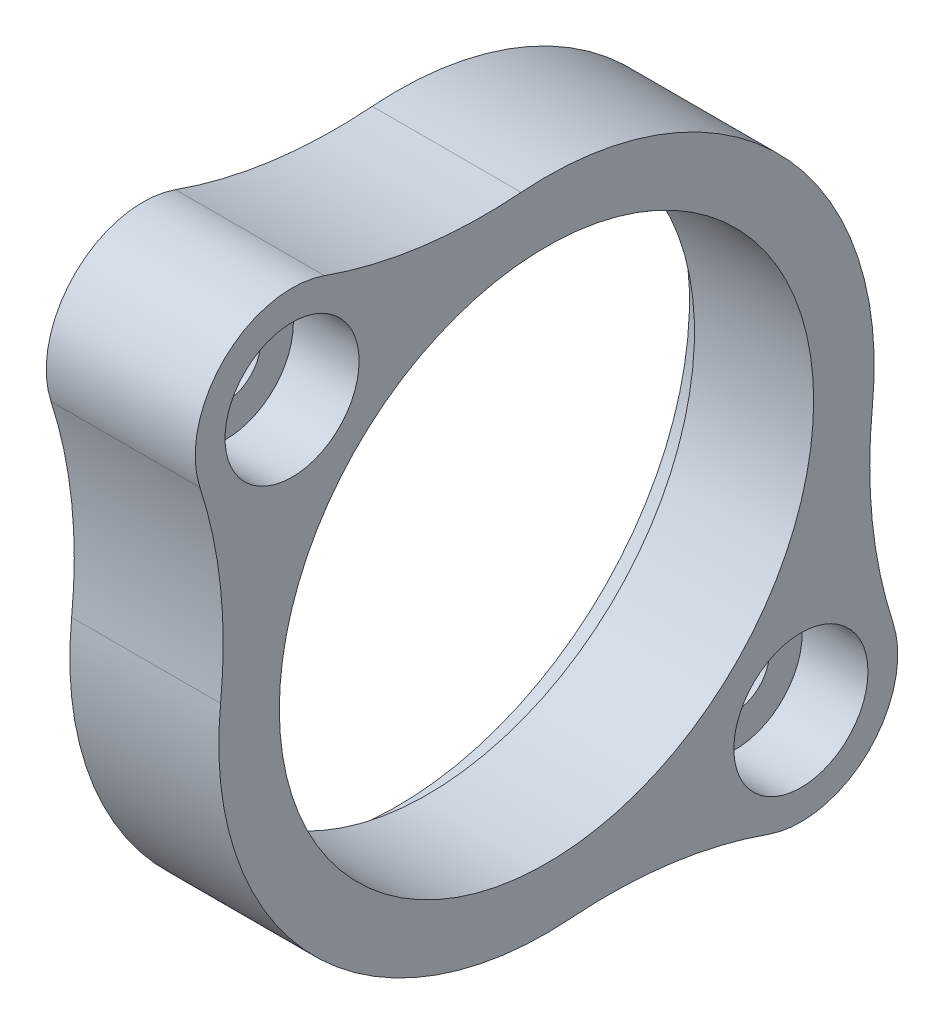
ISO-10303-21;
HEADER;
FILE_DESCRIPTION(('STEP AP214'),'2;1');
FILE_NAME('part.step','',(''),(''),'','','');
FILE_SCHEMA(('AUTOMOTIVE_DESIGN { 1 0 10303 214 1 1 1 1 }'));
ENDSEC;
DATA;
#1=APPLICATION_CONTEXT('core data for automotive mechanical design processes');
#2=APPLICATION_PROTOCOL_DEFINITION('international standard','automotive_design',2000,#1);
#3=PRODUCT_CONTEXT('',#1,'mechanical');
#4=PRODUCT('Part','Part','',(#3));
#5=PRODUCT_RELATED_PRODUCT_CATEGORY('part','',(#4));
#6=PRODUCT_DEFINITION_FORMATION('','',#4);
#7=PRODUCT_DEFINITION_CONTEXT('part definition',#1,'design');
#8=PRODUCT_DEFINITION('design','',#6,#7);
#9=PRODUCT_DEFINITION_SHAPE('','',#8);
#10=(LENGTH_UNIT() NAMED_UNIT(*) SI_UNIT(.MILLI.,.METRE.));
#11=(NAMED_UNIT(*) PLANE_ANGLE_UNIT() SI_UNIT($,.RADIAN.));
#12=(NAMED_UNIT(*) SI_UNIT($,.STERADIAN.) SOLID_ANGLE_UNIT());
#13=UNCERTAINTY_MEASURE_WITH_UNIT(LENGTH_MEASURE(1.E-05),#10,'distance_accuracy_value','');
#14=(GEOMETRIC_REPRESENTATION_CONTEXT(3) GLOBAL_UNCERTAINTY_ASSIGNED_CONTEXT((#13)) GLOBAL_UNIT_ASSIGNED_CONTEXT((#10,
#11,#12)) REPRESENTATION_CONTEXT('',''));
#15=CARTESIAN_POINT('',(0.,0.,0.));
#16=DIRECTION('',(0.,0.,1.));
#17=DIRECTION('',(1.,0.,0.));
#18=AXIS2_PLACEMENT_3D('',#15,#16,#17);
#19=CARTESIAN_POINT('',(54.0385,40.64,-145.269790757238));
#20=DIRECTION('',(-1.,0.,0.));
#21=DIRECTION('',(0.,0.,1.));
#22=AXIS2_PLACEMENT_3D('',#19,#20,#21);
#23=CYLINDRICAL_SURFACE('',#22,14.2367);
#24=CARTESIAN_POINT('',(54.0385,40.64,-145.269790757238));
#25=DIRECTION('',(1.,0.,0.));
#26=DIRECTION('',(0.,0.,-1.));
#27=AXIS2_PLACEMENT_3D('',#24,#25,#26);
#28=CIRCLE('',#27,14.2367);
#29=CARTESIAN_POINT('',(54.0385,40.64,-159.506490757238));
#30=VERTEX_POINT('',#29);
#31=EDGE_CURVE('E219',#30,#30,#28,.T.);
#32=ORIENTED_EDGE('',*,*,#31,.T.);
#33=EDGE_LOOP('',(#32));
#34=FACE_BOUND('',#33,.T.);
#35=CARTESIAN_POINT('',(47.6885,40.64,-145.269790757238));
#36=DIRECTION('',(-1.,0.,0.));
#37=DIRECTION('',(0.,0.,1.));
#38=AXIS2_PLACEMENT_3D('',#35,#36,#37);
#39=CIRCLE('',#38,14.2367);
#40=CARTESIAN_POINT('',(47.6885,40.64,-131.033090757238));
#41=VERTEX_POINT('',#40);
#42=EDGE_CURVE('E134',#41,#41,#39,.T.);
#43=ORIENTED_EDGE('',*,*,#42,.T.);
#44=EDGE_LOOP('',(#43));
#45=FACE_BOUND('',#44,.T.);
#46=ADVANCED_FACE('F130',(#34,#45),#23,.F.);
#47=CARTESIAN_POINT('',(54.0385,40.64,-145.269790757238));
#48=DIRECTION('',(-1.,0.,0.));
#49=DIRECTION('',(0.,0.,1.));
#50=AXIS2_PLACEMENT_3D('',#47,#48,#49);
#51=CYLINDRICAL_SURFACE('',#50,17.4625);
#52=CARTESIAN_POINT('',(54.0385,40.64,-145.269790757238));
#53=DIRECTION('',(1.,0.,0.));
#54=DIRECTION('',(0.,0.,-1.));
#55=AXIS2_PLACEMENT_3D('',#52,#53,#54);
#56=CIRCLE('',#55,17.4625);
#57=CARTESIAN_POINT('',(54.0385,42.477013840604,-127.904184335364));
#58=VERTEX_POINT('',#57);
#59=CARTESIAN_POINT('',(54.0385,23.2297021836331,-146.61902616865));
#60=VERTEX_POINT('',#59);
#61=EDGE_CURVE('E209',#58,#60,#56,.T.);
#62=ORIENTED_EDGE('',*,*,#61,.F.);
#63=DIRECTION('',(-1.,0.,0.));
#64=VECTOR('',#63,1.);
#65=CARTESIAN_POINT('',(54.0385,42.477013840604,-127.904184335364));
#66=LINE('',#65,#64);
#67=CARTESIAN_POINT('',(46.101,42.477013840604,-127.904184335364));
#68=VERTEX_POINT('',#67);
#69=EDGE_CURVE('E277',#58,#68,#66,.T.);
#70=ORIENTED_EDGE('',*,*,#69,.T.);
#71=CARTESIAN_POINT('',(46.101,40.64,-145.269790757238));
#72=DIRECTION('',(1.,0.,0.));
#73=DIRECTION('',(0.,0.,-1.));
#74=AXIS2_PLACEMENT_3D('',#71,#72,#73);
#75=CIRCLE('',#74,17.4625);
#76=CARTESIAN_POINT('',(46.101,23.2297021836331,-146.61902616865));
#77=VERTEX_POINT('',#76);
#78=EDGE_CURVE('E271',#68,#77,#75,.T.);
#79=ORIENTED_EDGE('',*,*,#78,.T.);
#80=DIRECTION('',(-1.,0.,0.));
#81=VECTOR('',#80,1.);
#82=CARTESIAN_POINT('',(54.0385,23.2297021836331,-146.61902616865));
#83=LINE('',#82,#81);
#84=EDGE_CURVE('E274',#77,#60,#83,.F.);
#85=ORIENTED_EDGE('',*,*,#84,.T.);
#86=EDGE_LOOP('',(#62,#70,#79,#85));
#87=FACE_BOUND('',#86,.T.);
#88=ADVANCED_FACE('F293',(#87),#51,.T.);
#89=CARTESIAN_POINT('',(54.0385,40.64,-145.269790757238));
#90=DIRECTION('',(1.,0.,0.));
#91=DIRECTION('',(0.,0.,-1.));
#92=AXIS2_PLACEMENT_3D('',#89,#90,#91);
#93=PLANE('',#92);
#94=CARTESIAN_POINT('',(54.0385,54.5829773591439,-131.712540757238));
#95=DIRECTION('',(1.,0.,0.));
#96=DIRECTION('',(0.,0.,-1.));
#97=AXIS2_PLACEMENT_3D('',#94,#95,#96);
#98=CIRCLE('',#97,3.57250999999999);
#99=CARTESIAN_POINT('',(54.0385,54.5829773591439,-135.285050757238));
#100=VERTEX_POINT('',#99);
#101=EDGE_CURVE('E253',#100,#100,#98,.T.);
#102=ORIENTED_EDGE('',*,*,#101,.F.);
#103=EDGE_LOOP('',(#102));
#104=FACE_BOUND('',#103,.T.);
#105=CARTESIAN_POINT('',(54.0385,26.6970226408561,-158.827040757238));
#106=DIRECTION('',(1.,0.,0.));
#107=DIRECTION('',(0.,0.,-1.));
#108=AXIS2_PLACEMENT_3D('',#105,#106,#107);
#109=CIRCLE('',#108,3.57250999999999);
#110=CARTESIAN_POINT('',(54.0385,26.6970226408561,-162.399550757238));
#111=VERTEX_POINT('',#110);
#112=EDGE_CURVE('E240',#111,#111,#109,.T.);
#113=ORIENTED_EDGE('',*,*,#112,.F.);
#114=EDGE_LOOP('',(#113));
#115=FACE_BOUND('',#114,.T.);
#116=CARTESIAN_POINT('',(54.0385,54.5829773591439,-131.712540757238));
#117=DIRECTION('',(1.,0.,0.));
#118=DIRECTION('',(0.,0.,-1.));
#119=AXIS2_PLACEMENT_3D('',#116,#117,#118);
#120=CIRCLE('',#119,5.16000999999995);
#121=CARTESIAN_POINT('',(54.0385,59.4443586334543,-133.442475815523));
#122=VERTEX_POINT('',#121);
#123=CARTESIAN_POINT('',(54.0385,52.9900707398373,-126.804552197526));
#124=VERTEX_POINT('',#123);
#125=EDGE_CURVE('E205',#122,#124,#120,.T.);
#126=ORIENTED_EDGE('',*,*,#125,.T.);
#127=CARTESIAN_POINT('',(54.0385,45.1490339723917,-102.645120449002));
#128=DIRECTION('',(1.,0.,0.));
#129=DIRECTION('',(0.,0.,-1.));
#130=AXIS2_PLACEMENT_3D('',#127,#128,#129);
#131=CIRCLE('',#130,25.4);
#132=EDGE_CURVE('E286',#124,#58,#131,.F.);
#133=ORIENTED_EDGE('',*,*,#132,.T.);
#134=ORIENTED_EDGE('',*,*,#61,.T.);
#135=CARTESIAN_POINT('',(54.0385,-2.0943673674461,-148.581550403432));
#136=DIRECTION('',(1.,0.,0.));
#137=DIRECTION('',(0.,0.,-1.));
#138=AXIS2_PLACEMENT_3D('',#135,#136,#137);
#139=CIRCLE('',#138,25.4);
#140=CARTESIAN_POINT('',(54.0385,21.8356413665457,-157.097105698953));
#141=VERTEX_POINT('',#140);
#142=EDGE_CURVE('E154',#60,#141,#139,.F.);
#143=ORIENTED_EDGE('',*,*,#142,.T.);
#144=CARTESIAN_POINT('',(54.0385,26.6970226408561,-158.827040757238));
#145=DIRECTION('',(1.,0.,0.));
#146=DIRECTION('',(0.,0.,-1.));
#147=AXIS2_PLACEMENT_3D('',#144,#145,#146);
#148=CIRCLE('',#147,5.16000999999998);
#149=CARTESIAN_POINT('',(54.0385,28.2899292601627,-163.735029316951));
#150=VERTEX_POINT('',#149);
#151=EDGE_CURVE('E236',#141,#150,#148,.T.);
#152=ORIENTED_EDGE('',*,*,#151,.T.);
#153=CARTESIAN_POINT('',(54.0385,36.1309660276084,-187.894461065474));
#154=DIRECTION('',(1.,0.,0.));
#155=DIRECTION('',(0.,0.,-1.));
#156=AXIS2_PLACEMENT_3D('',#153,#154,#155);
#157=CIRCLE('',#156,25.4);
#158=CARTESIAN_POINT('',(54.0385,38.802986159396,-162.635397179112));
#159=VERTEX_POINT('',#158);
#160=EDGE_CURVE('E12',#150,#159,#157,.F.);
#161=ORIENTED_EDGE('',*,*,#160,.T.);
#162=CARTESIAN_POINT('',(54.0385,58.0502978163669,-143.920555345826));
#163=VERTEX_POINT('',#162);
#164=EDGE_CURVE('E268',#159,#163,#56,.T.);
#165=ORIENTED_EDGE('',*,*,#164,.T.);
#166=CARTESIAN_POINT('',(54.0385,83.3743673674461,-141.958031111044));
#167=DIRECTION('',(1.,0.,0.));
#168=DIRECTION('',(0.,0.,-1.));
#169=AXIS2_PLACEMENT_3D('',#166,#167,#168);
#170=CIRCLE('',#169,25.4);
#171=EDGE_CURVE('E225',#163,#122,#170,.F.);
#172=ORIENTED_EDGE('',*,*,#171,.T.);
#173=EDGE_LOOP('',(#126,#133,#134,#143,#152,#161,#165,#172));
#174=FACE_BOUND('',#173,.T.);
#175=ORIENTED_EDGE('',*,*,#31,.F.);
#176=EDGE_LOOP('',(#175));
#177=FACE_BOUND('',#176,.T.);
#178=ADVANCED_FACE('F288',(#104,#115,#174,#177),#93,.T.);
#179=CARTESIAN_POINT('',(46.101,40.64,-145.269790757238));
#180=DIRECTION('',(1.,0.,0.));
#181=DIRECTION('',(0.,0.,-1.));
#182=AXIS2_PLACEMENT_3D('',#179,#180,#181);
#183=PLANE('',#182);
#184=CARTESIAN_POINT('',(46.101,40.64,-145.269790757238));
#185=DIRECTION('',(-1.,0.,0.));
#186=DIRECTION('',(0.,0.,1.));
#187=AXIS2_PLACEMENT_3D('',#184,#185,#186);
#188=CIRCLE('',#187,15.5575);
#189=CARTESIAN_POINT('',(46.101,40.64,-129.712290757238));
#190=VERTEX_POINT('',#189);
#191=EDGE_CURVE('E384',#190,#190,#188,.T.);
#192=ORIENTED_EDGE('',*,*,#191,.F.);
#193=EDGE_LOOP('',(#192));
#194=FACE_BOUND('',#193,.T.);
#195=CARTESIAN_POINT('',(46.101,54.5829773591439,-131.712540757238));
#196=DIRECTION('',(1.,0.,0.));
#197=DIRECTION('',(0.,0.,-1.));
#198=AXIS2_PLACEMENT_3D('',#195,#196,#197);
#199=CIRCLE('',#198,1.8288);
#200=CARTESIAN_POINT('',(46.101,54.5829773591439,-133.541340757238));
#201=VERTEX_POINT('',#200);
#202=EDGE_CURVE('E238',#201,#201,#199,.T.);
#203=ORIENTED_EDGE('',*,*,#202,.T.);
#204=EDGE_LOOP('',(#203));
#205=FACE_BOUND('',#204,.T.);
#206=CARTESIAN_POINT('',(46.101,26.6970226408561,-158.827040757238));
#207=DIRECTION('',(1.,0.,0.));
#208=DIRECTION('',(0.,0.,-1.));
#209=AXIS2_PLACEMENT_3D('',#206,#207,#208);
#210=CIRCLE('',#209,1.8288);
#211=CARTESIAN_POINT('',(46.101,26.6970226408561,-160.655840757238));
#212=VERTEX_POINT('',#211);
#213=EDGE_CURVE('E234',#212,#212,#210,.T.);
#214=ORIENTED_EDGE('',*,*,#213,.T.);
#215=EDGE_LOOP('',(#214));
#216=FACE_BOUND('',#215,.T.);
#217=CARTESIAN_POINT('',(46.101,38.802986159396,-162.635397179112));
#218=VERTEX_POINT('',#217);
#219=CARTESIAN_POINT('',(46.101,58.0502978163669,-143.920555345826));
#220=VERTEX_POINT('',#219);
#221=EDGE_CURVE('E267',#218,#220,#75,.T.);
#222=ORIENTED_EDGE('',*,*,#221,.F.);
#223=CARTESIAN_POINT('',(46.101,36.1309660276084,-187.894461065474));
#224=DIRECTION('',(1.,0.,0.));
#225=DIRECTION('',(0.,0.,-1.));
#226=AXIS2_PLACEMENT_3D('',#223,#224,#225);
#227=CIRCLE('',#226,25.4);
#228=CARTESIAN_POINT('',(46.101,28.2899292601627,-163.735029316951));
#229=VERTEX_POINT('',#228);
#230=EDGE_CURVE('E139',#218,#229,#227,.T.);
#231=ORIENTED_EDGE('',*,*,#230,.T.);
#232=CARTESIAN_POINT('',(46.101,26.6970226408561,-158.827040757238));
#233=DIRECTION('',(-1.,0.,0.));
#234=DIRECTION('',(0.,0.,1.));
#235=AXIS2_PLACEMENT_3D('',#232,#233,#234);
#236=CIRCLE('',#235,5.16000999999998);
#237=CARTESIAN_POINT('',(46.101,21.8356413665457,-157.097105698953));
#238=VERTEX_POINT('',#237);
#239=EDGE_CURVE('E262',#238,#229,#236,.F.);
#240=ORIENTED_EDGE('',*,*,#239,.F.);
#241=CARTESIAN_POINT('',(46.101,-2.0943673674461,-148.581550403432));
#242=DIRECTION('',(1.,0.,0.));
#243=DIRECTION('',(0.,0.,-1.));
#244=AXIS2_PLACEMENT_3D('',#241,#242,#243);
#245=CIRCLE('',#244,25.4);
#246=EDGE_CURVE('E227',#238,#77,#245,.T.);
#247=ORIENTED_EDGE('',*,*,#246,.T.);
#248=ORIENTED_EDGE('',*,*,#78,.F.);
#249=CARTESIAN_POINT('',(46.101,45.1490339723917,-102.645120449002));
#250=DIRECTION('',(1.,0.,0.));
#251=DIRECTION('',(0.,0.,-1.));
#252=AXIS2_PLACEMENT_3D('',#249,#250,#251);
#253=CIRCLE('',#252,25.4);
#254=CARTESIAN_POINT('',(46.101,52.9900707398373,-126.804552197526));
#255=VERTEX_POINT('',#254);
#256=EDGE_CURVE('E218',#68,#255,#253,.T.);
#257=ORIENTED_EDGE('',*,*,#256,.T.);
#258=CARTESIAN_POINT('',(46.101,54.5829773591439,-131.712540757238));
#259=DIRECTION('',(-1.,0.,0.));
#260=DIRECTION('',(0.,0.,1.));
#261=AXIS2_PLACEMENT_3D('',#258,#259,#260);
#262=CIRCLE('',#261,5.16000999999995);
#263=CARTESIAN_POINT('',(46.101,59.4443586334543,-133.442475815523));
#264=VERTEX_POINT('',#263);
#265=EDGE_CURVE('E202',#264,#255,#262,.F.);
#266=ORIENTED_EDGE('',*,*,#265,.F.);
#267=CARTESIAN_POINT('',(46.101,83.3743673674461,-141.958031111044));
#268=DIRECTION('',(1.,0.,0.));
#269=DIRECTION('',(0.,0.,-1.));
#270=AXIS2_PLACEMENT_3D('',#267,#268,#269);
#271=CIRCLE('',#270,25.4);
#272=EDGE_CURVE('E214',#264,#220,#271,.T.);
#273=ORIENTED_EDGE('',*,*,#272,.T.);
#274=EDGE_LOOP('',(#222,#231,#240,#247,#248,#257,#266,#273));
#275=FACE_BOUND('',#274,.T.);
#276=ADVANCED_FACE('F213',(#194,#205,#216,#275),#183,.F.);
#277=ORIENTED_EDGE('',*,*,#221,.T.);
#278=DIRECTION('',(-1.,0.,0.));
#279=VECTOR('',#278,1.);
#280=CARTESIAN_POINT('',(54.0385,58.0502978163669,-143.920555345826));
#281=LINE('',#280,#279);
#282=EDGE_CURVE('E224',#220,#163,#281,.F.);
#283=ORIENTED_EDGE('',*,*,#282,.T.);
#284=ORIENTED_EDGE('',*,*,#164,.F.);
#285=DIRECTION('',(-1.,0.,0.));
#286=VECTOR('',#285,1.);
#287=CARTESIAN_POINT('',(54.0385,38.802986159396,-162.635397179112));
#288=LINE('',#287,#286);
#289=EDGE_CURVE('E279',#159,#218,#288,.T.);
#290=ORIENTED_EDGE('',*,*,#289,.T.);
#291=EDGE_LOOP('',(#277,#283,#284,#290));
#292=FACE_BOUND('',#291,.T.);
#293=ADVANCED_FACE('F314',(#292),#51,.T.);
#294=CARTESIAN_POINT('',(31.5062877520384,54.5829773591439,-131.712540757238));
#295=DIRECTION('',(1.,0.,0.));
#296=DIRECTION('',(0.,0.,-1.));
#297=AXIS2_PLACEMENT_3D('',#294,#295,#296);
#298=CYLINDRICAL_SURFACE('',#297,5.16000999999995);
#299=ORIENTED_EDGE('',*,*,#265,.T.);
#300=DIRECTION('',(1.,0.,0.));
#301=VECTOR('',#300,1.);
#302=CARTESIAN_POINT('',(31.5062877520384,52.9900707398373,-126.804552197526));
#303=LINE('',#302,#301);
#304=EDGE_CURVE('E208',#255,#124,#303,.T.);
#305=ORIENTED_EDGE('',*,*,#304,.T.);
#306=ORIENTED_EDGE('',*,*,#125,.F.);
#307=DIRECTION('',(1.,0.,0.));
#308=VECTOR('',#307,1.);
#309=CARTESIAN_POINT('',(31.5062877520384,59.4443586334543,-133.442475815523));
#310=LINE('',#309,#308);
#311=EDGE_CURVE('E198',#122,#264,#310,.F.);
#312=ORIENTED_EDGE('',*,*,#311,.T.);
#313=EDGE_LOOP('',(#299,#305,#306,#312));
#314=FACE_BOUND('',#313,.T.);
#315=ADVANCED_FACE('F200',(#314),#298,.T.);
#316=CARTESIAN_POINT('',(31.5062877520384,26.6970226408561,-158.827040757238));
#317=DIRECTION('',(1.,0.,0.));
#318=DIRECTION('',(0.,0.,-1.));
#319=AXIS2_PLACEMENT_3D('',#316,#317,#318);
#320=CYLINDRICAL_SURFACE('',#319,5.16000999999998);
#321=ORIENTED_EDGE('',*,*,#151,.F.);
#322=DIRECTION('',(1.,0.,0.));
#323=VECTOR('',#322,1.);
#324=CARTESIAN_POINT('',(31.5062877520384,21.8356413665457,-157.097105698953));
#325=LINE('',#324,#323);
#326=EDGE_CURVE('E284',#141,#238,#325,.F.);
#327=ORIENTED_EDGE('',*,*,#326,.T.);
#328=ORIENTED_EDGE('',*,*,#239,.T.);
#329=DIRECTION('',(1.,0.,0.));
#330=VECTOR('',#329,1.);
#331=CARTESIAN_POINT('',(31.5062877520384,28.2899292601627,-163.735029316951));
#332=LINE('',#331,#330);
#333=EDGE_CURVE('E147',#229,#150,#332,.T.);
#334=ORIENTED_EDGE('',*,*,#333,.T.);
#335=EDGE_LOOP('',(#321,#327,#328,#334));
#336=FACE_BOUND('',#335,.T.);
#337=ADVANCED_FACE('F298',(#336),#320,.T.);
#338=CARTESIAN_POINT('',(54.0385,45.1490339723917,-102.645120449002));
#339=DIRECTION('',(-1.,0.,0.));
#340=DIRECTION('',(0.,0.,1.));
#341=AXIS2_PLACEMENT_3D('',#338,#339,#340);
#342=CYLINDRICAL_SURFACE('',#341,25.4);
#343=ORIENTED_EDGE('',*,*,#256,.F.);
#344=ORIENTED_EDGE('',*,*,#69,.F.);
#345=ORIENTED_EDGE('',*,*,#132,.F.);
#346=ORIENTED_EDGE('',*,*,#304,.F.);
#347=EDGE_LOOP('',(#343,#344,#345,#346));
#348=FACE_BOUND('',#347,.T.);
#349=ADVANCED_FACE('F296',(#348),#342,.F.);
#350=CARTESIAN_POINT('',(31.5062877520384,83.3743673674461,-141.958031111044));
#351=DIRECTION('',(-1.,0.,0.));
#352=DIRECTION('',(0.,0.,1.));
#353=AXIS2_PLACEMENT_3D('',#350,#351,#352);
#354=CYLINDRICAL_SURFACE('',#353,25.4);
#355=ORIENTED_EDGE('',*,*,#272,.F.);
#356=ORIENTED_EDGE('',*,*,#311,.F.);
#357=ORIENTED_EDGE('',*,*,#171,.F.);
#358=ORIENTED_EDGE('',*,*,#282,.F.);
#359=EDGE_LOOP('',(#355,#356,#357,#358));
#360=FACE_BOUND('',#359,.T.);
#361=ADVANCED_FACE('F222',(#360),#354,.F.);
#362=CARTESIAN_POINT('',(31.5062877520384,-2.0943673674461,-148.581550403432));
#363=DIRECTION('',(-1.,0.,0.));
#364=DIRECTION('',(0.,0.,1.));
#365=AXIS2_PLACEMENT_3D('',#362,#363,#364);
#366=CYLINDRICAL_SURFACE('',#365,25.4);
#367=ORIENTED_EDGE('',*,*,#246,.F.);
#368=ORIENTED_EDGE('',*,*,#326,.F.);
#369=ORIENTED_EDGE('',*,*,#142,.F.);
#370=ORIENTED_EDGE('',*,*,#84,.F.);
#371=EDGE_LOOP('',(#367,#368,#369,#370));
#372=FACE_BOUND('',#371,.T.);
#373=ADVANCED_FACE('F304',(#372),#366,.F.);
#374=CARTESIAN_POINT('',(31.5062877520384,36.1309660276084,-187.894461065474));
#375=DIRECTION('',(1.,0.,0.));
#376=DIRECTION('',(0.,0.,-1.));
#377=AXIS2_PLACEMENT_3D('',#374,#375,#376);
#378=CYLINDRICAL_SURFACE('',#377,25.4);
#379=ORIENTED_EDGE('',*,*,#160,.F.);
#380=ORIENTED_EDGE('',*,*,#333,.F.);
#381=ORIENTED_EDGE('',*,*,#230,.F.);
#382=ORIENTED_EDGE('',*,*,#289,.F.);
#383=EDGE_LOOP('',(#379,#380,#381,#382));
#384=FACE_BOUND('',#383,.T.);
#385=ADVANCED_FACE('F132',(#384),#378,.F.);
#386=CARTESIAN_POINT('',(54.0385,26.6970226408561,-158.827040757238));
#387=DIRECTION('',(1.,0.,0.));
#388=DIRECTION('',(0.,0.,-1.));
#389=AXIS2_PLACEMENT_3D('',#386,#387,#388);
#390=CYLINDRICAL_SURFACE('',#389,1.8288);
#391=CARTESIAN_POINT('',(50.5333,26.6970226408561,-158.827040757238));
#392=DIRECTION('',(1.,0.,0.));
#393=DIRECTION('',(0.,0.,-1.));
#394=AXIS2_PLACEMENT_3D('',#391,#392,#393);
#395=CIRCLE('',#394,1.8288);
#396=CARTESIAN_POINT('',(50.5333,26.6970226408561,-160.655840757238));
#397=VERTEX_POINT('',#396);
#398=EDGE_CURVE('E237',#397,#397,#395,.T.);
#399=ORIENTED_EDGE('',*,*,#398,.T.);
#400=EDGE_LOOP('',(#399));
#401=FACE_BOUND('',#400,.T.);
#402=ORIENTED_EDGE('',*,*,#213,.F.);
#403=EDGE_LOOP('',(#402));
#404=FACE_BOUND('',#403,.T.);
#405=ADVANCED_FACE('F340',(#401,#404),#390,.F.);
#406=CARTESIAN_POINT('',(50.5333,28.5258226408561,-158.827040757238));
#407=DIRECTION('',(-1.,0.,0.));
#408=DIRECTION('',(0.,0.,1.));
#409=AXIS2_PLACEMENT_3D('',#406,#407,#408);
#410=PLANE('',#409);
#411=ORIENTED_EDGE('',*,*,#398,.F.);
#412=EDGE_LOOP('',(#411));
#413=FACE_BOUND('',#412,.T.);
#414=CARTESIAN_POINT('',(50.5333,26.6970226408561,-158.827040757238));
#415=DIRECTION('',(1.,0.,0.));
#416=DIRECTION('',(0.,0.,-1.));
#417=AXIS2_PLACEMENT_3D('',#414,#415,#416);
#418=CIRCLE('',#417,3.57250999999999);
#419=CARTESIAN_POINT('',(50.5333,26.6970226408561,-162.399550757238));
#420=VERTEX_POINT('',#419);
#421=EDGE_CURVE('E245',#420,#420,#418,.T.);
#422=ORIENTED_EDGE('',*,*,#421,.T.);
#423=EDGE_LOOP('',(#422));
#424=FACE_BOUND('',#423,.T.);
#425=ADVANCED_FACE('F344',(#413,#424),#410,.F.);
#426=CARTESIAN_POINT('',(54.0385,26.6970226408561,-158.827040757238));
#427=DIRECTION('',(1.,0.,0.));
#428=DIRECTION('',(0.,0.,-1.));
#429=AXIS2_PLACEMENT_3D('',#426,#427,#428);
#430=CYLINDRICAL_SURFACE('',#429,3.57250999999999);
#431=ORIENTED_EDGE('',*,*,#421,.F.);
#432=EDGE_LOOP('',(#431));
#433=FACE_BOUND('',#432,.T.);
#434=ORIENTED_EDGE('',*,*,#112,.T.);
#435=EDGE_LOOP('',(#434));
#436=FACE_BOUND('',#435,.T.);
#437=ADVANCED_FACE('F350',(#433,#436),#430,.F.);
#438=CARTESIAN_POINT('',(54.0385,54.5829773591439,-131.712540757238));
#439=DIRECTION('',(1.,0.,0.));
#440=DIRECTION('',(0.,0.,-1.));
#441=AXIS2_PLACEMENT_3D('',#438,#439,#440);
#442=CYLINDRICAL_SURFACE('',#441,1.8288);
#443=CARTESIAN_POINT('',(50.5333,54.5829773591439,-131.712540757238));
#444=DIRECTION('',(1.,0.,0.));
#445=DIRECTION('',(0.,0.,-1.));
#446=AXIS2_PLACEMENT_3D('',#443,#444,#445);
#447=CIRCLE('',#446,1.8288);
#448=CARTESIAN_POINT('',(50.5333,54.5829773591439,-133.541340757238));
#449=VERTEX_POINT('',#448);
#450=EDGE_CURVE('E241',#449,#449,#447,.T.);
#451=ORIENTED_EDGE('',*,*,#450,.T.);
#452=EDGE_LOOP('',(#451));
#453=FACE_BOUND('',#452,.T.);
#454=ORIENTED_EDGE('',*,*,#202,.F.);
#455=EDGE_LOOP('',(#454));
#456=FACE_BOUND('',#455,.T.);
#457=ADVANCED_FACE('F357',(#453,#456),#442,.F.);
#458=CARTESIAN_POINT('',(50.5333,56.4117773591439,-131.712540757238));
#459=DIRECTION('',(-1.,0.,0.));
#460=DIRECTION('',(0.,0.,1.));
#461=AXIS2_PLACEMENT_3D('',#458,#459,#460);
#462=PLANE('',#461);
#463=ORIENTED_EDGE('',*,*,#450,.F.);
#464=EDGE_LOOP('',(#463));
#465=FACE_BOUND('',#464,.T.);
#466=CARTESIAN_POINT('',(50.5333,54.5829773591439,-131.712540757238));
#467=DIRECTION('',(1.,0.,0.));
#468=DIRECTION('',(0.,0.,-1.));
#469=AXIS2_PLACEMENT_3D('',#466,#467,#468);
#470=CIRCLE('',#469,3.57250999999999);
#471=CARTESIAN_POINT('',(50.5333,54.5829773591439,-135.285050757238));
#472=VERTEX_POINT('',#471);
#473=EDGE_CURVE('E248',#472,#472,#470,.T.);
#474=ORIENTED_EDGE('',*,*,#473,.T.);
#475=EDGE_LOOP('',(#474));
#476=FACE_BOUND('',#475,.T.);
#477=ADVANCED_FACE('F361',(#465,#476),#462,.F.);
#478=CARTESIAN_POINT('',(54.0385,54.5829773591439,-131.712540757238));
#479=DIRECTION('',(1.,0.,0.));
#480=DIRECTION('',(0.,0.,-1.));
#481=AXIS2_PLACEMENT_3D('',#478,#479,#480);
#482=CYLINDRICAL_SURFACE('',#481,3.57250999999999);
#483=ORIENTED_EDGE('',*,*,#473,.F.);
#484=EDGE_LOOP('',(#483));
#485=FACE_BOUND('',#484,.T.);
#486=ORIENTED_EDGE('',*,*,#101,.T.);
#487=EDGE_LOOP('',(#486));
#488=FACE_BOUND('',#487,.T.);
#489=ADVANCED_FACE('F364',(#485,#488),#482,.F.);
#490=CARTESIAN_POINT('',(47.6885,40.64,-145.269790757238));
#491=DIRECTION('',(-1.,0.,0.));
#492=DIRECTION('',(0.,0.,1.));
#493=AXIS2_PLACEMENT_3D('',#490,#491,#492);
#494=CYLINDRICAL_SURFACE('',#493,15.5575);
#495=CARTESIAN_POINT('',(47.6885,40.64,-145.269790757238));
#496=DIRECTION('',(-1.,0.,0.));
#497=DIRECTION('',(0.,0.,1.));
#498=AXIS2_PLACEMENT_3D('',#495,#496,#497);
#499=CIRCLE('',#498,15.5575);
#500=CARTESIAN_POINT('',(47.6885,40.64,-129.712290757238));
#501=VERTEX_POINT('',#500);
#502=EDGE_CURVE('E383',#501,#501,#499,.T.);
#503=ORIENTED_EDGE('',*,*,#502,.F.);
#504=EDGE_LOOP('',(#503));
#505=FACE_BOUND('',#504,.T.);
#506=ORIENTED_EDGE('',*,*,#191,.T.);
#507=EDGE_LOOP('',(#506));
#508=FACE_BOUND('',#507,.T.);
#509=ADVANCED_FACE('F368',(#505,#508),#494,.F.);
#510=CARTESIAN_POINT('',(47.6885,40.64,-145.269790757238));
#511=DIRECTION('',(-1.,0.,0.));
#512=DIRECTION('',(0.,0.,1.));
#513=AXIS2_PLACEMENT_3D('',#510,#511,#512);
#514=PLANE('',#513);
#515=ORIENTED_EDGE('',*,*,#42,.F.);
#516=EDGE_LOOP('',(#515));
#517=FACE_BOUND('',#516,.T.);
#518=ORIENTED_EDGE('',*,*,#502,.T.);
#519=EDGE_LOOP('',(#518));
#520=FACE_BOUND('',#519,.T.);
#521=ADVANCED_FACE('F372',(#517,#520),#514,.T.);
#522=CLOSED_SHELL('',(#46,#88,#178,#276,#293,#315,#337,#349,#361,#373,#385,#405,#425,#437,#457,
#477,#489,#509,#521));
#523=MANIFOLD_SOLID_BREP('B2',#522);
#524=ADVANCED_BREP_SHAPE_REPRESENTATION('',(#18,#523),#14);
#525=SHAPE_DEFINITION_REPRESENTATION(#9,#524);
ENDSEC;
END-ISO-10303-21;
